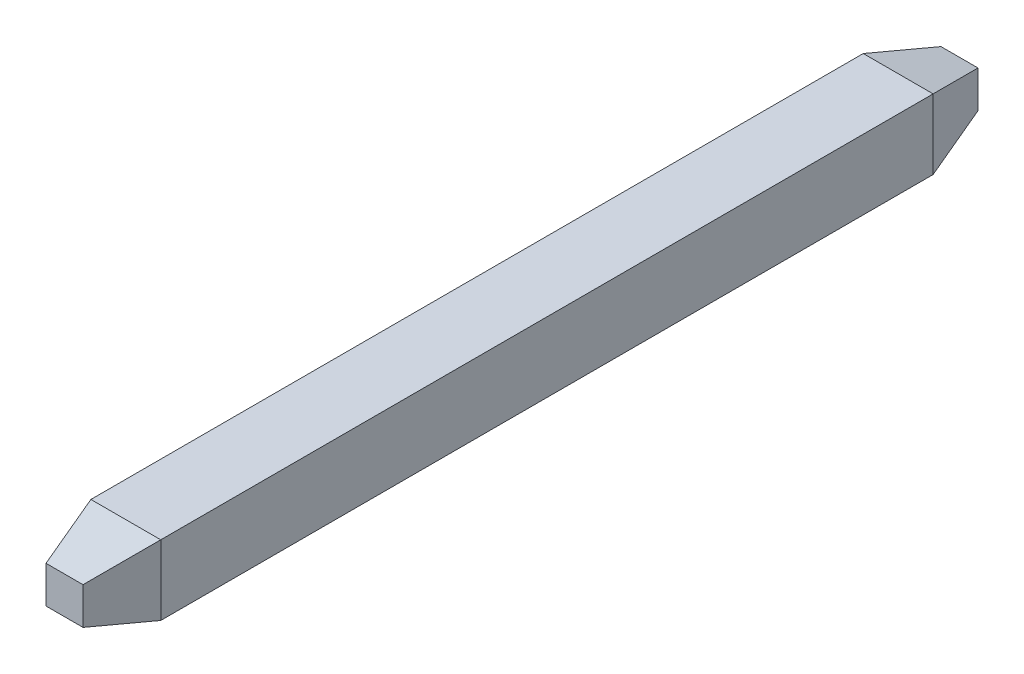
ISO-10303-21;
HEADER;
FILE_DESCRIPTION(('STEP AP214'),'2;1');
FILE_NAME('part.step','',(''),(''),'','','');
FILE_SCHEMA(('AUTOMOTIVE_DESIGN { 1 0 10303 214 1 1 1 1 }'));
ENDSEC;
DATA;
#1=APPLICATION_CONTEXT('core data for automotive mechanical design processes');
#2=APPLICATION_PROTOCOL_DEFINITION('international standard','automotive_design',2000,#1);
#3=PRODUCT_CONTEXT('',#1,'mechanical');
#4=PRODUCT('Part','Part','',(#3));
#5=PRODUCT_RELATED_PRODUCT_CATEGORY('part','',(#4));
#6=PRODUCT_DEFINITION_FORMATION('','',#4);
#7=PRODUCT_DEFINITION_CONTEXT('part definition',#1,'design');
#8=PRODUCT_DEFINITION('design','',#6,#7);
#9=PRODUCT_DEFINITION_SHAPE('','',#8);
#10=(LENGTH_UNIT() NAMED_UNIT(*) SI_UNIT(.MILLI.,.METRE.));
#11=(NAMED_UNIT(*) PLANE_ANGLE_UNIT() SI_UNIT($,.RADIAN.));
#12=(NAMED_UNIT(*) SI_UNIT($,.STERADIAN.) SOLID_ANGLE_UNIT());
#13=UNCERTAINTY_MEASURE_WITH_UNIT(LENGTH_MEASURE(1.E-05),#10,'distance_accuracy_value','');
#14=(GEOMETRIC_REPRESENTATION_CONTEXT(3) GLOBAL_UNCERTAINTY_ASSIGNED_CONTEXT((#13)) GLOBAL_UNIT_ASSIGNED_CONTEXT((#10,
#11,#12)) REPRESENTATION_CONTEXT('',''));
#15=CARTESIAN_POINT('',(0.,0.,0.));
#16=DIRECTION('',(0.,0.,1.));
#17=DIRECTION('',(1.,0.,0.));
#18=AXIS2_PLACEMENT_3D('',#15,#16,#17);
#19=CARTESIAN_POINT('',(-0.302050807568876,0.,10.9));
#20=DIRECTION('',(-0.965925826289069,0.,0.258819045102517));
#21=DIRECTION('',(0.258819045102517,0.,0.965925826289069));
#22=AXIS2_PLACEMENT_3D('',#19,#20,#21);
#23=PLANE('',#22);
#24=DIRECTION('',(0.250562807085729,-0.250562807085729,0.935113126531031));
#25=VECTOR('',#24,1.);
#26=CARTESIAN_POINT('',(-0.57,0.57,9.89999999999998));
#27=LINE('',#26,#25);
#28=CARTESIAN_POINT('',(-0.57,0.57,9.89999999999998));
#29=VERTEX_POINT('',#28);
#30=CARTESIAN_POINT('',(-0.302050807568876,0.302050807568876,10.9));
#31=VERTEX_POINT('',#30);
#32=EDGE_CURVE('E84',#29,#31,#27,.T.);
#33=ORIENTED_EDGE('',*,*,#32,.F.);
#34=DIRECTION('',(0.,1.,0.));
#35=VECTOR('',#34,1.);
#36=CARTESIAN_POINT('',(-0.57,-0.57,9.89999999999998));
#37=LINE('',#36,#35);
#38=CARTESIAN_POINT('',(-0.57,-0.57,9.89999999999998));
#39=VERTEX_POINT('',#38);
#40=EDGE_CURVE('E119',#29,#39,#37,.F.);
#41=ORIENTED_EDGE('',*,*,#40,.T.);
#42=DIRECTION('',(-0.250562807085729,-0.250562807085729,-0.935113126531031));
#43=VECTOR('',#42,1.);
#44=CARTESIAN_POINT('',(-0.302050807568876,-0.302050807568876,10.9));
#45=LINE('',#44,#43);
#46=CARTESIAN_POINT('',(-0.302050807568876,-0.302050807568876,10.9));
#47=VERTEX_POINT('',#46);
#48=EDGE_CURVE('E96',#47,#39,#45,.T.);
#49=ORIENTED_EDGE('',*,*,#48,.F.);
#50=DIRECTION('',(0.,1.,0.));
#51=VECTOR('',#50,1.);
#52=CARTESIAN_POINT('',(-0.302050807568876,0.,10.9));
#53=LINE('',#52,#51);
#54=EDGE_CURVE('E19',#31,#47,#53,.F.);
#55=ORIENTED_EDGE('',*,*,#54,.F.);
#56=EDGE_LOOP('',(#33,#41,#49,#55));
#57=FACE_BOUND('',#56,.T.);
#58=ADVANCED_FACE('F16',(#57),#23,.T.);
#59=CARTESIAN_POINT('',(-0.302050807568876,0.,-3.7));
#60=DIRECTION('',(0.965925826289069,0.,0.258819045102517));
#61=DIRECTION('',(0.258819045102517,0.,-0.965925826289069));
#62=AXIS2_PLACEMENT_3D('',#59,#60,#61);
#63=PLANE('',#62);
#64=DIRECTION('',(0.,1.,0.));
#65=VECTOR('',#64,1.);
#66=CARTESIAN_POINT('',(-0.302050807568876,0.,-3.7));
#67=LINE('',#66,#65);
#68=CARTESIAN_POINT('',(-0.302050807568876,0.302050807568876,-3.7));
#69=VERTEX_POINT('',#68);
#70=CARTESIAN_POINT('',(-0.302050807568876,-0.302050807568876,-3.7));
#71=VERTEX_POINT('',#70);
#72=EDGE_CURVE('E78',#69,#71,#67,.F.);
#73=ORIENTED_EDGE('',*,*,#72,.T.);
#74=DIRECTION('',(-0.250562807085728,-0.250562807085729,0.935113126531031));
#75=VECTOR('',#74,1.);
#76=CARTESIAN_POINT('',(-0.302050807568876,-0.302050807568876,-3.7));
#77=LINE('',#76,#75);
#78=CARTESIAN_POINT('',(-0.57,-0.57,-2.69999999999998));
#79=VERTEX_POINT('',#78);
#80=EDGE_CURVE('E116',#71,#79,#77,.T.);
#81=ORIENTED_EDGE('',*,*,#80,.T.);
#82=DIRECTION('',(0.,1.,0.));
#83=VECTOR('',#82,1.);
#84=CARTESIAN_POINT('',(-0.57,-0.57,-2.69999999999998));
#85=LINE('',#84,#83);
#86=CARTESIAN_POINT('',(-0.57,0.57,-2.69999999999998));
#87=VERTEX_POINT('',#86);
#88=EDGE_CURVE('E121',#79,#87,#85,.T.);
#89=ORIENTED_EDGE('',*,*,#88,.T.);
#90=DIRECTION('',(0.250562807085729,-0.250562807085729,-0.935113126531031));
#91=VECTOR('',#90,1.);
#92=CARTESIAN_POINT('',(-0.57,0.57,-2.69999999999998));
#93=LINE('',#92,#91);
#94=EDGE_CURVE('E108',#87,#69,#93,.T.);
#95=ORIENTED_EDGE('',*,*,#94,.T.);
#96=EDGE_LOOP('',(#73,#81,#89,#95));
#97=FACE_BOUND('',#96,.T.);
#98=ADVANCED_FACE('F211',(#97),#63,.F.);
#99=CARTESIAN_POINT('',(0.,0.,10.9));
#100=DIRECTION('',(0.,0.,1.));
#101=DIRECTION('',(1.,0.,0.));
#102=AXIS2_PLACEMENT_3D('',#99,#100,#101);
#103=PLANE('',#102);
#104=ORIENTED_EDGE('',*,*,#54,.T.);
#105=DIRECTION('',(1.,0.,0.));
#106=VECTOR('',#105,1.);
#107=CARTESIAN_POINT('',(0.,-0.302050807568876,10.9));
#108=LINE('',#107,#106);
#109=CARTESIAN_POINT('',(0.302050807568876,-0.302050807568876,10.9));
#110=VERTEX_POINT('',#109);
#111=EDGE_CURVE('E112',#110,#47,#108,.F.);
#112=ORIENTED_EDGE('',*,*,#111,.F.);
#113=DIRECTION('',(0.,1.,0.));
#114=VECTOR('',#113,1.);
#115=CARTESIAN_POINT('',(0.302050807568876,0.,10.9));
#116=LINE('',#115,#114);
#117=CARTESIAN_POINT('',(0.302050807568876,0.302050807568876,10.9));
#118=VERTEX_POINT('',#117);
#119=EDGE_CURVE('E102',#118,#110,#116,.F.);
#120=ORIENTED_EDGE('',*,*,#119,.F.);
#121=DIRECTION('',(1.,0.,0.));
#122=VECTOR('',#121,1.);
#123=CARTESIAN_POINT('',(0.,0.302050807568876,10.9));
#124=LINE('',#123,#122);
#125=EDGE_CURVE('E89',#31,#118,#124,.T.);
#126=ORIENTED_EDGE('',*,*,#125,.F.);
#127=EDGE_LOOP('',(#104,#112,#120,#126));
#128=FACE_BOUND('',#127,.T.);
#129=ADVANCED_FACE('F100',(#128),#103,.T.);
#130=CARTESIAN_POINT('',(0.,0.302050807568876,10.9));
#131=DIRECTION('',(0.,0.965925826289069,0.258819045102517));
#132=DIRECTION('',(0.,-0.258819045102517,0.965925826289069));
#133=AXIS2_PLACEMENT_3D('',#130,#131,#132);
#134=PLANE('',#133);
#135=ORIENTED_EDGE('',*,*,#32,.T.);
#136=ORIENTED_EDGE('',*,*,#125,.T.);
#137=DIRECTION('',(-0.250562807085729,-0.250562807085729,0.935113126531031));
#138=VECTOR('',#137,1.);
#139=CARTESIAN_POINT('',(0.569999999999999,0.57,9.89999999999998));
#140=LINE('',#139,#138);
#141=CARTESIAN_POINT('',(0.57,0.57,9.89999999999998));
#142=VERTEX_POINT('',#141);
#143=EDGE_CURVE('E126',#142,#118,#140,.T.);
#144=ORIENTED_EDGE('',*,*,#143,.F.);
#145=DIRECTION('',(1.,0.,0.));
#146=VECTOR('',#145,1.);
#147=CARTESIAN_POINT('',(0.57,0.57,9.89999999999998));
#148=LINE('',#147,#146);
#149=EDGE_CURVE('E91',#142,#29,#148,.F.);
#150=ORIENTED_EDGE('',*,*,#149,.T.);
#151=EDGE_LOOP('',(#135,#136,#144,#150));
#152=FACE_BOUND('',#151,.T.);
#153=ADVANCED_FACE('F86',(#152),#134,.T.);
#154=CARTESIAN_POINT('',(0.,0.,-3.7));
#155=DIRECTION('',(0.,0.,1.));
#156=DIRECTION('',(1.,0.,0.));
#157=AXIS2_PLACEMENT_3D('',#154,#155,#156);
#158=PLANE('',#157);
#159=DIRECTION('',(1.,0.,0.));
#160=VECTOR('',#159,1.);
#161=CARTESIAN_POINT('',(0.,-0.302050807568876,-3.7));
#162=LINE('',#161,#160);
#163=CARTESIAN_POINT('',(0.302050807568876,-0.302050807568876,-3.7));
#164=VERTEX_POINT('',#163);
#165=EDGE_CURVE('E114',#164,#71,#162,.F.);
#166=ORIENTED_EDGE('',*,*,#165,.T.);
#167=ORIENTED_EDGE('',*,*,#72,.F.);
#168=DIRECTION('',(1.,0.,0.));
#169=VECTOR('',#168,1.);
#170=CARTESIAN_POINT('',(0.,0.302050807568876,-3.7));
#171=LINE('',#170,#169);
#172=CARTESIAN_POINT('',(0.302050807568876,0.302050807568876,-3.7));
#173=VERTEX_POINT('',#172);
#174=EDGE_CURVE('E104',#69,#173,#171,.T.);
#175=ORIENTED_EDGE('',*,*,#174,.T.);
#176=DIRECTION('',(0.,1.,0.));
#177=VECTOR('',#176,1.);
#178=CARTESIAN_POINT('',(0.302050807568876,0.,-3.7));
#179=LINE('',#178,#177);
#180=EDGE_CURVE('E136',#173,#164,#179,.F.);
#181=ORIENTED_EDGE('',*,*,#180,.T.);
#182=EDGE_LOOP('',(#166,#167,#175,#181));
#183=FACE_BOUND('',#182,.T.);
#184=ADVANCED_FACE('F204',(#183),#158,.F.);
#185=CARTESIAN_POINT('',(0.,0.302050807568876,-3.7));
#186=DIRECTION('',(0.,-0.965925826289069,0.258819045102517));
#187=DIRECTION('',(0.,-0.258819045102517,-0.965925826289069));
#188=AXIS2_PLACEMENT_3D('',#185,#186,#187);
#189=PLANE('',#188);
#190=DIRECTION('',(1.,0.,0.));
#191=VECTOR('',#190,1.);
#192=CARTESIAN_POINT('',(0.57,0.57,-2.69999999999998));
#193=LINE('',#192,#191);
#194=CARTESIAN_POINT('',(0.57,0.57,-2.69999999999998));
#195=VERTEX_POINT('',#194);
#196=EDGE_CURVE('E133',#87,#195,#193,.T.);
#197=ORIENTED_EDGE('',*,*,#196,.T.);
#198=DIRECTION('',(-0.250562807085729,-0.250562807085729,-0.935113126531031));
#199=VECTOR('',#198,1.);
#200=CARTESIAN_POINT('',(0.57,0.57,-2.69999999999998));
#201=LINE('',#200,#199);
#202=EDGE_CURVE('E141',#195,#173,#201,.T.);
#203=ORIENTED_EDGE('',*,*,#202,.T.);
#204=ORIENTED_EDGE('',*,*,#174,.F.);
#205=ORIENTED_EDGE('',*,*,#94,.F.);
#206=EDGE_LOOP('',(#197,#203,#204,#205));
#207=FACE_BOUND('',#206,.T.);
#208=ADVANCED_FACE('F201',(#207),#189,.F.);
#209=CARTESIAN_POINT('',(0.,-0.302050807568876,10.9));
#210=DIRECTION('',(0.,-0.965925826289069,0.258819045102517));
#211=DIRECTION('',(0.,-0.258819045102517,-0.965925826289069));
#212=AXIS2_PLACEMENT_3D('',#209,#210,#211);
#213=PLANE('',#212);
#214=DIRECTION('',(0.250562807085729,-0.250562807085729,-0.935113126531031));
#215=VECTOR('',#214,1.);
#216=CARTESIAN_POINT('',(0.302050807568876,-0.302050807568876,10.9));
#217=LINE('',#216,#215);
#218=CARTESIAN_POINT('',(0.57,-0.57,9.89999999999998));
#219=VERTEX_POINT('',#218);
#220=EDGE_CURVE('E124',#110,#219,#217,.T.);
#221=ORIENTED_EDGE('',*,*,#220,.F.);
#222=ORIENTED_EDGE('',*,*,#111,.T.);
#223=ORIENTED_EDGE('',*,*,#48,.T.);
#224=DIRECTION('',(1.,0.,0.));
#225=VECTOR('',#224,1.);
#226=CARTESIAN_POINT('',(0.57,-0.57,9.89999999999998));
#227=LINE('',#226,#225);
#228=EDGE_CURVE('E144',#39,#219,#227,.T.);
#229=ORIENTED_EDGE('',*,*,#228,.T.);
#230=EDGE_LOOP('',(#221,#222,#223,#229));
#231=FACE_BOUND('',#230,.T.);
#232=ADVANCED_FACE('F175',(#231),#213,.T.);
#233=CARTESIAN_POINT('',(0.,-0.302050807568876,-3.7));
#234=DIRECTION('',(0.,0.965925826289069,0.258819045102517));
#235=DIRECTION('',(0.,-0.258819045102517,0.965925826289069));
#236=AXIS2_PLACEMENT_3D('',#233,#234,#235);
#237=PLANE('',#236);
#238=DIRECTION('',(1.,0.,0.));
#239=VECTOR('',#238,1.);
#240=CARTESIAN_POINT('',(0.57,-0.57,-2.69999999999998));
#241=LINE('',#240,#239);
#242=CARTESIAN_POINT('',(0.57,-0.57,-2.69999999999998));
#243=VERTEX_POINT('',#242);
#244=EDGE_CURVE('E33',#243,#79,#241,.F.);
#245=ORIENTED_EDGE('',*,*,#244,.T.);
#246=ORIENTED_EDGE('',*,*,#80,.F.);
#247=ORIENTED_EDGE('',*,*,#165,.F.);
#248=DIRECTION('',(0.250562807085729,-0.250562807085729,0.935113126531031));
#249=VECTOR('',#248,1.);
#250=CARTESIAN_POINT('',(0.302050807568876,-0.302050807568876,-3.7));
#251=LINE('',#250,#249);
#252=EDGE_CURVE('E139',#164,#243,#251,.T.);
#253=ORIENTED_EDGE('',*,*,#252,.T.);
#254=EDGE_LOOP('',(#245,#246,#247,#253));
#255=FACE_BOUND('',#254,.T.);
#256=ADVANCED_FACE('F194',(#255),#237,.F.);
#257=CARTESIAN_POINT('',(-0.57,-0.57,10.9));
#258=DIRECTION('',(1.,0.,0.));
#259=DIRECTION('',(0.,0.,-1.));
#260=AXIS2_PLACEMENT_3D('',#257,#258,#259);
#261=PLANE('',#260);
#262=ORIENTED_EDGE('',*,*,#88,.F.);
#263=DIRECTION('',(0.,0.,1.));
#264=VECTOR('',#263,1.);
#265=CARTESIAN_POINT('',(-0.57,-0.57,10.9));
#266=LINE('',#265,#264);
#267=EDGE_CURVE('E148',#79,#39,#266,.T.);
#268=ORIENTED_EDGE('',*,*,#267,.T.);
#269=ORIENTED_EDGE('',*,*,#40,.F.);
#270=DIRECTION('',(0.,0.,-1.));
#271=VECTOR('',#270,1.);
#272=CARTESIAN_POINT('',(-0.57,0.57,10.9));
#273=LINE('',#272,#271);
#274=EDGE_CURVE('E130',#29,#87,#273,.T.);
#275=ORIENTED_EDGE('',*,*,#274,.T.);
#276=EDGE_LOOP('',(#262,#268,#269,#275));
#277=FACE_BOUND('',#276,.T.);
#278=ADVANCED_FACE('F191',(#277),#261,.F.);
#279=CARTESIAN_POINT('',(0.302050807568876,0.,10.9));
#280=DIRECTION('',(0.965925826289069,0.,0.258819045102517));
#281=DIRECTION('',(0.258819045102517,0.,-0.965925826289069));
#282=AXIS2_PLACEMENT_3D('',#279,#280,#281);
#283=PLANE('',#282);
#284=ORIENTED_EDGE('',*,*,#143,.T.);
#285=ORIENTED_EDGE('',*,*,#119,.T.);
#286=ORIENTED_EDGE('',*,*,#220,.T.);
#287=DIRECTION('',(0.,1.,0.));
#288=VECTOR('',#287,1.);
#289=CARTESIAN_POINT('',(0.57,-0.57,9.89999999999998));
#290=LINE('',#289,#288);
#291=EDGE_CURVE('E151',#219,#142,#290,.T.);
#292=ORIENTED_EDGE('',*,*,#291,.T.);
#293=EDGE_LOOP('',(#284,#285,#286,#292));
#294=FACE_BOUND('',#293,.T.);
#295=ADVANCED_FACE('F171',(#294),#283,.T.);
#296=CARTESIAN_POINT('',(0.57,0.57,10.9));
#297=DIRECTION('',(0.,-1.,0.));
#298=DIRECTION('',(0.,0.,-1.));
#299=AXIS2_PLACEMENT_3D('',#296,#297,#298);
#300=PLANE('',#299);
#301=ORIENTED_EDGE('',*,*,#196,.F.);
#302=ORIENTED_EDGE('',*,*,#274,.F.);
#303=ORIENTED_EDGE('',*,*,#149,.F.);
#304=DIRECTION('',(0.,0.,1.));
#305=VECTOR('',#304,1.);
#306=CARTESIAN_POINT('',(0.57,0.57,10.9));
#307=LINE('',#306,#305);
#308=EDGE_CURVE('E154',#142,#195,#307,.F.);
#309=ORIENTED_EDGE('',*,*,#308,.T.);
#310=EDGE_LOOP('',(#301,#302,#303,#309));
#311=FACE_BOUND('',#310,.T.);
#312=ADVANCED_FACE('F169',(#311),#300,.F.);
#313=CARTESIAN_POINT('',(0.302050807568876,0.,-3.7));
#314=DIRECTION('',(-0.965925826289069,0.,0.258819045102517));
#315=DIRECTION('',(0.258819045102517,0.,0.965925826289069));
#316=AXIS2_PLACEMENT_3D('',#313,#314,#315);
#317=PLANE('',#316);
#318=DIRECTION('',(0.,1.,0.));
#319=VECTOR('',#318,1.);
#320=CARTESIAN_POINT('',(0.57,-0.57,-2.69999999999998));
#321=LINE('',#320,#319);
#322=EDGE_CURVE('E25',#195,#243,#321,.F.);
#323=ORIENTED_EDGE('',*,*,#322,.T.);
#324=ORIENTED_EDGE('',*,*,#252,.F.);
#325=ORIENTED_EDGE('',*,*,#180,.F.);
#326=ORIENTED_EDGE('',*,*,#202,.F.);
#327=EDGE_LOOP('',(#323,#324,#325,#326));
#328=FACE_BOUND('',#327,.T.);
#329=ADVANCED_FACE('F161',(#328),#317,.F.);
#330=CARTESIAN_POINT('',(0.57,-0.57,10.9));
#331=DIRECTION('',(0.,1.,0.));
#332=DIRECTION('',(0.,0.,1.));
#333=AXIS2_PLACEMENT_3D('',#330,#331,#332);
#334=PLANE('',#333);
#335=ORIENTED_EDGE('',*,*,#244,.F.);
#336=DIRECTION('',(0.,0.,1.));
#337=VECTOR('',#336,1.);
#338=CARTESIAN_POINT('',(0.57,-0.57,10.9));
#339=LINE('',#338,#337);
#340=EDGE_CURVE('E10',#243,#219,#339,.T.);
#341=ORIENTED_EDGE('',*,*,#340,.T.);
#342=ORIENTED_EDGE('',*,*,#228,.F.);
#343=ORIENTED_EDGE('',*,*,#267,.F.);
#344=EDGE_LOOP('',(#335,#341,#342,#343));
#345=FACE_BOUND('',#344,.T.);
#346=ADVANCED_FACE('F176',(#345),#334,.F.);
#347=CARTESIAN_POINT('',(0.57,-0.57,10.9));
#348=DIRECTION('',(-1.,0.,0.));
#349=DIRECTION('',(0.,0.,1.));
#350=AXIS2_PLACEMENT_3D('',#347,#348,#349);
#351=PLANE('',#350);
#352=ORIENTED_EDGE('',*,*,#322,.F.);
#353=ORIENTED_EDGE('',*,*,#308,.F.);
#354=ORIENTED_EDGE('',*,*,#291,.F.);
#355=ORIENTED_EDGE('',*,*,#340,.F.);
#356=EDGE_LOOP('',(#352,#353,#354,#355));
#357=FACE_BOUND('',#356,.T.);
#358=ADVANCED_FACE('F165',(#357),#351,.F.);
#359=CLOSED_SHELL('',(#58,#98,#129,#153,#184,#208,#232,#256,#278,#295,#312,#329,#346,#358));
#360=MANIFOLD_SOLID_BREP('B1',#359);
#361=ADVANCED_BREP_SHAPE_REPRESENTATION('',(#18,#360),#14);
#362=SHAPE_DEFINITION_REPRESENTATION(#9,#361);
ENDSEC;
END-ISO-10303-21;
